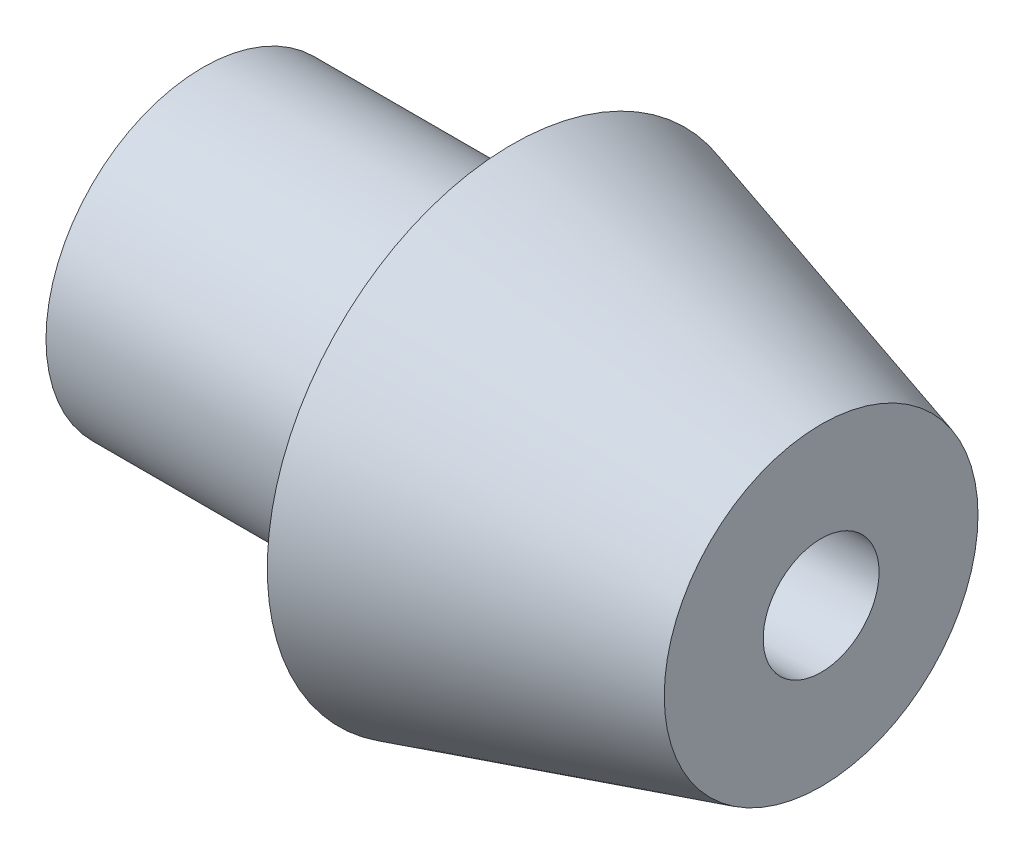
ISO-10303-21;
HEADER;
FILE_DESCRIPTION(('STEP AP214'),'2;1');
FILE_NAME('part.step','',(''),(''),'','','');
FILE_SCHEMA(('AUTOMOTIVE_DESIGN { 1 0 10303 214 1 1 1 1 }'));
ENDSEC;
DATA;
#1=APPLICATION_CONTEXT('core data for automotive mechanical design processes');
#2=APPLICATION_PROTOCOL_DEFINITION('international standard','automotive_design',2000,#1);
#3=PRODUCT_CONTEXT('',#1,'mechanical');
#4=PRODUCT('Part','Part','',(#3));
#5=PRODUCT_RELATED_PRODUCT_CATEGORY('part','',(#4));
#6=PRODUCT_DEFINITION_FORMATION('','',#4);
#7=PRODUCT_DEFINITION_CONTEXT('part definition',#1,'design');
#8=PRODUCT_DEFINITION('design','',#6,#7);
#9=PRODUCT_DEFINITION_SHAPE('','',#8);
#10=(LENGTH_UNIT() NAMED_UNIT(*) SI_UNIT(.MILLI.,.METRE.));
#11=(NAMED_UNIT(*) PLANE_ANGLE_UNIT() SI_UNIT($,.RADIAN.));
#12=(NAMED_UNIT(*) SI_UNIT($,.STERADIAN.) SOLID_ANGLE_UNIT());
#13=UNCERTAINTY_MEASURE_WITH_UNIT(LENGTH_MEASURE(1.E-05),#10,'distance_accuracy_value','');
#14=(GEOMETRIC_REPRESENTATION_CONTEXT(3) GLOBAL_UNCERTAINTY_ASSIGNED_CONTEXT((#13)) GLOBAL_UNIT_ASSIGNED_CONTEXT((#10,
#11,#12)) REPRESENTATION_CONTEXT('',''));
#15=CARTESIAN_POINT('',(0.,0.,0.));
#16=DIRECTION('',(0.,0.,1.));
#17=DIRECTION('',(1.,0.,0.));
#18=AXIS2_PLACEMENT_3D('',#15,#16,#17);
#19=CARTESIAN_POINT('',(-8.5939393939394,0.,0.));
#20=DIRECTION('',(-1.,0.,0.));
#21=DIRECTION('',(0.,0.,1.));
#22=AXIS2_PLACEMENT_3D('',#19,#20,#21);
#23=PLANE('',#22);
#24=CARTESIAN_POINT('',(-8.5939393939394,0.,0.));
#25=DIRECTION('',(-1.,0.,0.));
#26=DIRECTION('',(0.,0.,1.));
#27=AXIS2_PLACEMENT_3D('',#24,#25,#26);
#28=CIRCLE('',#27,4.04491024836026);
#29=CARTESIAN_POINT('',(-8.5939393939394,0.,4.04491024836026));
#30=VERTEX_POINT('',#29);
#31=EDGE_CURVE('E10',#30,#30,#28,.F.);
#32=ORIENTED_EDGE('',*,*,#31,.T.);
#33=EDGE_LOOP('',(#32));
#34=FACE_BOUND('',#33,.T.);
#35=CARTESIAN_POINT('',(-8.5939393939394,0.,0.));
#36=DIRECTION('',(1.,0.,0.));
#37=DIRECTION('',(0.,0.,-1.));
#38=AXIS2_PLACEMENT_3D('',#35,#36,#37);
#39=CIRCLE('',#38,4.75);
#40=CARTESIAN_POINT('',(-8.5939393939394,0.,-4.75));
#41=VERTEX_POINT('',#40);
#42=EDGE_CURVE('E50',#41,#41,#39,.T.);
#43=ORIENTED_EDGE('',*,*,#42,.F.);
#44=EDGE_LOOP('',(#43));
#45=FACE_BOUND('',#44,.T.);
#46=ADVANCED_FACE('F37',(#34,#45),#23,.T.);
#47=CARTESIAN_POINT('',(-2.5939393939394,0.,0.));
#48=DIRECTION('',(-1.,0.,0.));
#49=DIRECTION('',(0.,0.,1.));
#50=AXIS2_PLACEMENT_3D('',#47,#48,#49);
#51=CONICAL_SURFACE('',#50,3.04491024836026,0.276882098094583);
#52=ORIENTED_EDGE('',*,*,#42,.T.);
#53=EDGE_LOOP('',(#52));
#54=FACE_BOUND('',#53,.T.);
#55=CARTESIAN_POINT('',(-2.5939393939394,0.,0.));
#56=DIRECTION('',(1.,0.,0.));
#57=DIRECTION('',(0.,0.,-1.));
#58=AXIS2_PLACEMENT_3D('',#55,#56,#57);
#59=CIRCLE('',#58,3.04491024836026);
#60=CARTESIAN_POINT('',(-2.5939393939394,0.,-3.04491024836026));
#61=VERTEX_POINT('',#60);
#62=EDGE_CURVE('E55',#61,#61,#59,.T.);
#63=ORIENTED_EDGE('',*,*,#62,.F.);
#64=EDGE_LOOP('',(#63));
#65=FACE_BOUND('',#64,.T.);
#66=ADVANCED_FACE('F90',(#54,#65),#51,.T.);
#67=CARTESIAN_POINT('',(-2.5939393939394,3.04491024836026,0.));
#68=DIRECTION('',(1.,0.,0.));
#69=DIRECTION('',(0.,0.,-1.));
#70=AXIS2_PLACEMENT_3D('',#67,#68,#69);
#71=PLANE('',#70);
#72=CARTESIAN_POINT('',(-2.5939393939394,0.,0.));
#73=DIRECTION('',(1.,0.,0.));
#74=DIRECTION('',(0.,0.,-1.));
#75=AXIS2_PLACEMENT_3D('',#72,#73,#74);
#76=CIRCLE('',#75,1.125);
#77=CARTESIAN_POINT('',(-2.5939393939394,0.,-1.125));
#78=VERTEX_POINT('',#77);
#79=EDGE_CURVE('E61',#78,#78,#76,.T.);
#80=ORIENTED_EDGE('',*,*,#79,.F.);
#81=EDGE_LOOP('',(#80));
#82=FACE_BOUND('',#81,.T.);
#83=ORIENTED_EDGE('',*,*,#62,.T.);
#84=EDGE_LOOP('',(#83));
#85=FACE_BOUND('',#84,.T.);
#86=ADVANCED_FACE('F86',(#82,#85),#71,.T.);
#87=CARTESIAN_POINT('',(-8.59493939393939,0.,0.));
#88=DIRECTION('',(1.,0.,0.));
#89=DIRECTION('',(0.,0.,-1.));
#90=AXIS2_PLACEMENT_3D('',#87,#88,#89);
#91=CYLINDRICAL_SURFACE('',#90,1.125);
#92=ORIENTED_EDGE('',*,*,#79,.T.);
#93=EDGE_LOOP('',(#92));
#94=FACE_BOUND('',#93,.T.);
#95=CARTESIAN_POINT('',(-14.5939393939394,0.,0.));
#96=DIRECTION('',(-1.,0.,0.));
#97=DIRECTION('',(0.,0.,1.));
#98=AXIS2_PLACEMENT_3D('',#95,#96,#97);
#99=CIRCLE('',#98,1.125);
#100=CARTESIAN_POINT('',(-14.5939393939394,0.,1.125));
#101=VERTEX_POINT('',#100);
#102=EDGE_CURVE('E69',#101,#101,#99,.T.);
#103=ORIENTED_EDGE('',*,*,#102,.T.);
#104=EDGE_LOOP('',(#103));
#105=FACE_BOUND('',#104,.T.);
#106=ADVANCED_FACE('F74',(#94,#105),#91,.F.);
#107=CARTESIAN_POINT('',(-14.5939393939394,0.,0.));
#108=DIRECTION('',(-1.,0.,0.));
#109=DIRECTION('',(0.,0.,1.));
#110=AXIS2_PLACEMENT_3D('',#107,#108,#109);
#111=PLANE('',#110);
#112=CARTESIAN_POINT('',(-14.5939393939394,0.,0.));
#113=DIRECTION('',(-1.,0.,0.));
#114=DIRECTION('',(0.,0.,1.));
#115=AXIS2_PLACEMENT_3D('',#112,#113,#114);
#116=CIRCLE('',#115,3.04491024836026);
#117=CARTESIAN_POINT('',(-14.5939393939394,0.,3.04491024836026));
#118=VERTEX_POINT('',#117);
#119=EDGE_CURVE('E65',#118,#118,#116,.T.);
#120=ORIENTED_EDGE('',*,*,#119,.T.);
#121=EDGE_LOOP('',(#120));
#122=FACE_BOUND('',#121,.T.);
#123=ORIENTED_EDGE('',*,*,#102,.F.);
#124=EDGE_LOOP('',(#123));
#125=FACE_BOUND('',#124,.T.);
#126=ADVANCED_FACE('F76',(#122,#125),#111,.T.);
#127=CARTESIAN_POINT('',(-14.5939393939394,0.,0.));
#128=DIRECTION('',(1.,0.,0.));
#129=DIRECTION('',(0.,0.,-1.));
#130=AXIS2_PLACEMENT_3D('',#127,#128,#129);
#131=CYLINDRICAL_SURFACE('',#130,3.04491024836026);
#132=CARTESIAN_POINT('',(-9.59393939393939,0.,0.));
#133=DIRECTION('',(-1.,0.,0.));
#134=DIRECTION('',(0.,0.,1.));
#135=AXIS2_PLACEMENT_3D('',#132,#133,#134);
#136=CIRCLE('',#135,3.04491024836026);
#137=CARTESIAN_POINT('',(-9.59393939393939,0.,3.04491024836026));
#138=VERTEX_POINT('',#137);
#139=EDGE_CURVE('E45',#138,#138,#136,.T.);
#140=ORIENTED_EDGE('',*,*,#139,.T.);
#141=EDGE_LOOP('',(#140));
#142=FACE_BOUND('',#141,.T.);
#143=ORIENTED_EDGE('',*,*,#119,.F.);
#144=EDGE_LOOP('',(#143));
#145=FACE_BOUND('',#144,.T.);
#146=ADVANCED_FACE('F78',(#142,#145),#131,.T.);
#147=CARTESIAN_POINT('',(-9.59393939393939,0.,0.));
#148=DIRECTION('',(-1.,0.,0.));
#149=DIRECTION('',(0.,0.,1.));
#150=AXIS2_PLACEMENT_3D('',#147,#148,#149);
#151=TOROIDAL_SURFACE('',#150,4.04491024836026,1.);
#152=ORIENTED_EDGE('',*,*,#31,.F.);
#153=EDGE_LOOP('',(#152));
#154=FACE_BOUND('',#153,.T.);
#155=ORIENTED_EDGE('',*,*,#139,.F.);
#156=EDGE_LOOP('',(#155));
#157=FACE_BOUND('',#156,.T.);
#158=ADVANCED_FACE('F39',(#154,#157),#151,.F.);
#159=CLOSED_SHELL('',(#46,#66,#86,#106,#126,#146,#158));
#160=MANIFOLD_SOLID_BREP('B2',#159);
#161=ADVANCED_BREP_SHAPE_REPRESENTATION('',(#18,#160),#14);
#162=SHAPE_DEFINITION_REPRESENTATION(#9,#161);
ENDSEC;
END-ISO-10303-21;
